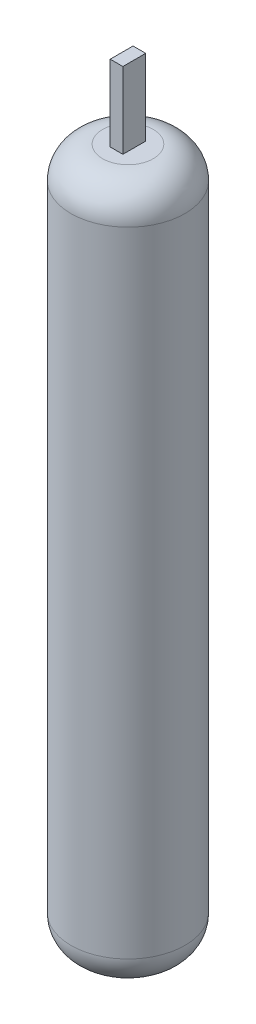
ISO-10303-21;
HEADER;
FILE_DESCRIPTION(('STEP AP214'),'2;1');
FILE_NAME('part.step','',(''),(''),'','','');
FILE_SCHEMA(('AUTOMOTIVE_DESIGN { 1 0 10303 214 1 1 1 1 }'));
ENDSEC;
DATA;
#1=APPLICATION_CONTEXT('core data for automotive mechanical design processes');
#2=APPLICATION_PROTOCOL_DEFINITION('international standard','automotive_design',2000,#1);
#3=PRODUCT_CONTEXT('',#1,'mechanical');
#4=PRODUCT('Part','Part','',(#3));
#5=PRODUCT_RELATED_PRODUCT_CATEGORY('part','',(#4));
#6=PRODUCT_DEFINITION_FORMATION('','',#4);
#7=PRODUCT_DEFINITION_CONTEXT('part definition',#1,'design');
#8=PRODUCT_DEFINITION('design','',#6,#7);
#9=PRODUCT_DEFINITION_SHAPE('','',#8);
#10=(LENGTH_UNIT() NAMED_UNIT(*) SI_UNIT(.MILLI.,.METRE.));
#11=(NAMED_UNIT(*) PLANE_ANGLE_UNIT() SI_UNIT($,.RADIAN.));
#12=(NAMED_UNIT(*) SI_UNIT($,.STERADIAN.) SOLID_ANGLE_UNIT());
#13=UNCERTAINTY_MEASURE_WITH_UNIT(LENGTH_MEASURE(1.E-05),#10,'distance_accuracy_value','');
#14=(GEOMETRIC_REPRESENTATION_CONTEXT(3) GLOBAL_UNCERTAINTY_ASSIGNED_CONTEXT((#13)) GLOBAL_UNIT_ASSIGNED_CONTEXT((#10,
#11,#12)) REPRESENTATION_CONTEXT('',''));
#15=CARTESIAN_POINT('',(0.,0.,0.));
#16=DIRECTION('',(0.,0.,1.));
#17=DIRECTION('',(1.,0.,0.));
#18=AXIS2_PLACEMENT_3D('',#15,#16,#17);
#19=CARTESIAN_POINT('',(0.,55.,0.));
#20=DIRECTION('',(0.,-1.,0.));
#21=DIRECTION('',(0.,0.,-1.));
#22=AXIS2_PLACEMENT_3D('',#19,#20,#21);
#23=CYLINDRICAL_SURFACE('',#22,4.5);
#24=CARTESIAN_POINT('',(0.,52.5,0.));
#25=DIRECTION('',(0.,1.,0.));
#26=DIRECTION('',(0.,0.,1.));
#27=AXIS2_PLACEMENT_3D('',#24,#25,#26);
#28=CIRCLE('',#27,4.5);
#29=CARTESIAN_POINT('',(0.,52.5,4.5));
#30=VERTEX_POINT('',#29);
#31=EDGE_CURVE('E48',#30,#30,#28,.F.);
#32=ORIENTED_EDGE('',*,*,#31,.T.);
#33=EDGE_LOOP('',(#32));
#34=FACE_BOUND('',#33,.T.);
#35=CARTESIAN_POINT('',(0.,2.5,0.));
#36=DIRECTION('',(0.,1.,0.));
#37=DIRECTION('',(0.,0.,1.));
#38=AXIS2_PLACEMENT_3D('',#35,#36,#37);
#39=CIRCLE('',#38,4.5);
#40=CARTESIAN_POINT('',(0.,2.5,4.5));
#41=VERTEX_POINT('',#40);
#42=EDGE_CURVE('E201',#41,#41,#39,.T.);
#43=ORIENTED_EDGE('',*,*,#42,.T.);
#44=EDGE_LOOP('',(#43));
#45=FACE_BOUND('',#44,.T.);
#46=ADVANCED_FACE('F39',(#34,#45),#23,.T.);
#47=CARTESIAN_POINT('',(0.,55.,0.));
#48=DIRECTION('',(0.,1.,0.));
#49=DIRECTION('',(0.,0.,1.));
#50=AXIS2_PLACEMENT_3D('',#47,#48,#49);
#51=PLANE('',#50);
#52=CARTESIAN_POINT('',(0.,55.,0.));
#53=DIRECTION('',(0.,1.,0.));
#54=DIRECTION('',(0.,0.,1.));
#55=AXIS2_PLACEMENT_3D('',#52,#53,#54);
#56=CIRCLE('',#55,2.);
#57=CARTESIAN_POINT('',(0.,55.,2.));
#58=VERTEX_POINT('',#57);
#59=EDGE_CURVE('E197',#58,#58,#56,.T.);
#60=ORIENTED_EDGE('',*,*,#59,.T.);
#61=EDGE_LOOP('',(#60));
#62=FACE_BOUND('',#61,.T.);
#63=DIRECTION('',(0.,0.,1.));
#64=VECTOR('',#63,1.);
#65=CARTESIAN_POINT('',(-0.5,55.,-0.9));
#66=LINE('',#65,#64);
#67=CARTESIAN_POINT('',(-0.5,55.,-0.9));
#68=VERTEX_POINT('',#67);
#69=CARTESIAN_POINT('',(-0.5,55.,0.9));
#70=VERTEX_POINT('',#69);
#71=EDGE_CURVE('E63',#68,#70,#66,.T.);
#72=ORIENTED_EDGE('',*,*,#71,.F.);
#73=DIRECTION('',(-1.,0.,0.));
#74=VECTOR('',#73,1.);
#75=CARTESIAN_POINT('',(-0.5,55.,-0.9));
#76=LINE('',#75,#74);
#77=CARTESIAN_POINT('',(0.5,55.,-0.9));
#78=VERTEX_POINT('',#77);
#79=EDGE_CURVE('E160',#78,#68,#76,.T.);
#80=ORIENTED_EDGE('',*,*,#79,.F.);
#81=DIRECTION('',(0.,0.,-1.));
#82=VECTOR('',#81,1.);
#83=CARTESIAN_POINT('',(0.5,55.,-0.9));
#84=LINE('',#83,#82);
#85=CARTESIAN_POINT('',(0.5,55.,0.9));
#86=VERTEX_POINT('',#85);
#87=EDGE_CURVE('E176',#86,#78,#84,.T.);
#88=ORIENTED_EDGE('',*,*,#87,.F.);
#89=DIRECTION('',(1.,0.,0.));
#90=VECTOR('',#89,1.);
#91=CARTESIAN_POINT('',(-0.5,55.,0.9));
#92=LINE('',#91,#90);
#93=EDGE_CURVE('E172',#70,#86,#92,.T.);
#94=ORIENTED_EDGE('',*,*,#93,.F.);
#95=EDGE_LOOP('',(#72,#80,#88,#94));
#96=FACE_BOUND('',#95,.T.);
#97=ADVANCED_FACE('F215',(#62,#96),#51,.T.);
#98=CARTESIAN_POINT('',(0.,0.,0.));
#99=DIRECTION('',(0.,1.,0.));
#100=DIRECTION('',(0.,0.,1.));
#101=AXIS2_PLACEMENT_3D('',#98,#99,#100);
#102=PLANE('',#101);
#103=CARTESIAN_POINT('',(0.,0.,0.));
#104=DIRECTION('',(0.,1.,0.));
#105=DIRECTION('',(0.,0.,1.));
#106=AXIS2_PLACEMENT_3D('',#103,#104,#105);
#107=CIRCLE('',#106,2.);
#108=CARTESIAN_POINT('',(0.,0.,2.));
#109=VERTEX_POINT('',#108);
#110=EDGE_CURVE('E11',#109,#109,#107,.F.);
#111=ORIENTED_EDGE('',*,*,#110,.T.);
#112=EDGE_LOOP('',(#111));
#113=FACE_BOUND('',#112,.T.);
#114=DIRECTION('',(1.,0.,0.));
#115=VECTOR('',#114,1.);
#116=CARTESIAN_POINT('',(-0.6,0.,-1.));
#117=LINE('',#116,#115);
#118=CARTESIAN_POINT('',(-0.6,0.,-1.));
#119=VERTEX_POINT('',#118);
#120=CARTESIAN_POINT('',(0.6,0.,-1.));
#121=VERTEX_POINT('',#120);
#122=EDGE_CURVE('E141',#119,#121,#117,.T.);
#123=ORIENTED_EDGE('',*,*,#122,.F.);
#124=DIRECTION('',(0.,0.,-1.));
#125=VECTOR('',#124,1.);
#126=CARTESIAN_POINT('',(-0.600000000000001,0.,1.));
#127=LINE('',#126,#125);
#128=CARTESIAN_POINT('',(-0.600000000000001,0.,1.));
#129=VERTEX_POINT('',#128);
#130=EDGE_CURVE('E55',#129,#119,#127,.T.);
#131=ORIENTED_EDGE('',*,*,#130,.F.);
#132=DIRECTION('',(-1.,0.,0.));
#133=VECTOR('',#132,1.);
#134=CARTESIAN_POINT('',(0.6,0.,1.));
#135=LINE('',#134,#133);
#136=CARTESIAN_POINT('',(0.6,0.,1.));
#137=VERTEX_POINT('',#136);
#138=EDGE_CURVE('E128',#137,#129,#135,.T.);
#139=ORIENTED_EDGE('',*,*,#138,.F.);
#140=DIRECTION('',(0.,0.,1.));
#141=VECTOR('',#140,1.);
#142=CARTESIAN_POINT('',(0.6,0.,-1.));
#143=LINE('',#142,#141);
#144=EDGE_CURVE('E132',#121,#137,#143,.T.);
#145=ORIENTED_EDGE('',*,*,#144,.F.);
#146=EDGE_LOOP('',(#123,#131,#139,#145));
#147=FACE_BOUND('',#146,.T.);
#148=ADVANCED_FACE('F217',(#113,#147),#102,.F.);
#149=CARTESIAN_POINT('',(-0.5,61.,-0.9));
#150=DIRECTION('',(1.,0.,0.));
#151=DIRECTION('',(0.,0.,-1.));
#152=AXIS2_PLACEMENT_3D('',#149,#150,#151);
#153=PLANE('',#152);
#154=ORIENTED_EDGE('',*,*,#71,.T.);
#155=DIRECTION('',(0.,-1.,0.));
#156=VECTOR('',#155,1.);
#157=CARTESIAN_POINT('',(-0.5,61.,0.9));
#158=LINE('',#157,#156);
#159=CARTESIAN_POINT('',(-0.5,61.,0.9));
#160=VERTEX_POINT('',#159);
#161=EDGE_CURVE('E193',#160,#70,#158,.T.);
#162=ORIENTED_EDGE('',*,*,#161,.F.);
#163=DIRECTION('',(0.,0.,1.));
#164=VECTOR('',#163,1.);
#165=CARTESIAN_POINT('',(-0.5,61.,-0.9));
#166=LINE('',#165,#164);
#167=CARTESIAN_POINT('',(-0.5,61.,-0.9));
#168=VERTEX_POINT('',#167);
#169=EDGE_CURVE('E155',#168,#160,#166,.T.);
#170=ORIENTED_EDGE('',*,*,#169,.F.);
#171=DIRECTION('',(0.,-1.,0.));
#172=VECTOR('',#171,1.);
#173=CARTESIAN_POINT('',(-0.5,61.,-0.9));
#174=LINE('',#173,#172);
#175=EDGE_CURVE('E169',#168,#68,#174,.T.);
#176=ORIENTED_EDGE('',*,*,#175,.T.);
#177=EDGE_LOOP('',(#154,#162,#170,#176));
#178=FACE_BOUND('',#177,.T.);
#179=ADVANCED_FACE('F223',(#178),#153,.F.);
#180=CARTESIAN_POINT('',(-0.5,61.,0.9));
#181=DIRECTION('',(0.,0.,-1.));
#182=DIRECTION('',(-1.,0.,0.));
#183=AXIS2_PLACEMENT_3D('',#180,#181,#182);
#184=PLANE('',#183);
#185=ORIENTED_EDGE('',*,*,#93,.T.);
#186=DIRECTION('',(0.,-1.,0.));
#187=VECTOR('',#186,1.);
#188=CARTESIAN_POINT('',(0.5,61.,0.9));
#189=LINE('',#188,#187);
#190=CARTESIAN_POINT('',(0.5,61.,0.9));
#191=VERTEX_POINT('',#190);
#192=EDGE_CURVE('E189',#191,#86,#189,.T.);
#193=ORIENTED_EDGE('',*,*,#192,.F.);
#194=DIRECTION('',(1.,0.,0.));
#195=VECTOR('',#194,1.);
#196=CARTESIAN_POINT('',(-0.5,61.,0.9));
#197=LINE('',#196,#195);
#198=EDGE_CURVE('E159',#160,#191,#197,.T.);
#199=ORIENTED_EDGE('',*,*,#198,.F.);
#200=ORIENTED_EDGE('',*,*,#161,.T.);
#201=EDGE_LOOP('',(#185,#193,#199,#200));
#202=FACE_BOUND('',#201,.T.);
#203=ADVANCED_FACE('F230',(#202),#184,.F.);
#204=CARTESIAN_POINT('',(0.5,61.,-0.9));
#205=DIRECTION('',(-1.,0.,0.));
#206=DIRECTION('',(0.,0.,1.));
#207=AXIS2_PLACEMENT_3D('',#204,#205,#206);
#208=PLANE('',#207);
#209=ORIENTED_EDGE('',*,*,#87,.T.);
#210=DIRECTION('',(0.,-1.,0.));
#211=VECTOR('',#210,1.);
#212=CARTESIAN_POINT('',(0.5,61.,-0.9));
#213=LINE('',#212,#211);
#214=CARTESIAN_POINT('',(0.5,61.,-0.9));
#215=VERTEX_POINT('',#214);
#216=EDGE_CURVE('E185',#215,#78,#213,.T.);
#217=ORIENTED_EDGE('',*,*,#216,.F.);
#218=DIRECTION('',(0.,0.,-1.));
#219=VECTOR('',#218,1.);
#220=CARTESIAN_POINT('',(0.5,61.,-0.9));
#221=LINE('',#220,#219);
#222=EDGE_CURVE('E163',#191,#215,#221,.T.);
#223=ORIENTED_EDGE('',*,*,#222,.F.);
#224=ORIENTED_EDGE('',*,*,#192,.T.);
#225=EDGE_LOOP('',(#209,#217,#223,#224));
#226=FACE_BOUND('',#225,.T.);
#227=ADVANCED_FACE('F234',(#226),#208,.F.);
#228=CARTESIAN_POINT('',(-0.5,61.,-0.9));
#229=DIRECTION('',(0.,0.,1.));
#230=DIRECTION('',(1.,0.,0.));
#231=AXIS2_PLACEMENT_3D('',#228,#229,#230);
#232=PLANE('',#231);
#233=ORIENTED_EDGE('',*,*,#79,.T.);
#234=ORIENTED_EDGE('',*,*,#175,.F.);
#235=DIRECTION('',(-1.,0.,0.));
#236=VECTOR('',#235,1.);
#237=CARTESIAN_POINT('',(-0.5,61.,-0.9));
#238=LINE('',#237,#236);
#239=EDGE_CURVE('E166',#215,#168,#238,.T.);
#240=ORIENTED_EDGE('',*,*,#239,.F.);
#241=ORIENTED_EDGE('',*,*,#216,.T.);
#242=EDGE_LOOP('',(#233,#234,#240,#241));
#243=FACE_BOUND('',#242,.T.);
#244=ADVANCED_FACE('F238',(#243),#232,.F.);
#245=CARTESIAN_POINT('',(0.,61.,0.));
#246=DIRECTION('',(0.,1.,0.));
#247=DIRECTION('',(0.,0.,1.));
#248=AXIS2_PLACEMENT_3D('',#245,#246,#247);
#249=PLANE('',#248);
#250=ORIENTED_EDGE('',*,*,#169,.T.);
#251=ORIENTED_EDGE('',*,*,#198,.T.);
#252=ORIENTED_EDGE('',*,*,#222,.T.);
#253=ORIENTED_EDGE('',*,*,#239,.T.);
#254=EDGE_LOOP('',(#250,#251,#252,#253));
#255=FACE_BOUND('',#254,.T.);
#256=ADVANCED_FACE('F242',(#255),#249,.T.);
#257=CARTESIAN_POINT('',(-0.600000000000001,6.,1.));
#258=DIRECTION('',(-1.,0.,0.));
#259=DIRECTION('',(0.,0.,1.));
#260=AXIS2_PLACEMENT_3D('',#257,#258,#259);
#261=PLANE('',#260);
#262=ORIENTED_EDGE('',*,*,#130,.T.);
#263=DIRECTION('',(0.,-1.,0.));
#264=VECTOR('',#263,1.);
#265=CARTESIAN_POINT('',(-0.6,6.,-1.));
#266=LINE('',#265,#264);
#267=CARTESIAN_POINT('',(-0.6,6.,-1.));
#268=VERTEX_POINT('',#267);
#269=EDGE_CURVE('E103',#268,#119,#266,.T.);
#270=ORIENTED_EDGE('',*,*,#269,.F.);
#271=DIRECTION('',(0.,0.,-1.));
#272=VECTOR('',#271,1.);
#273=CARTESIAN_POINT('',(-0.600000000000001,6.,1.));
#274=LINE('',#273,#272);
#275=CARTESIAN_POINT('',(-0.600000000000001,6.,1.));
#276=VERTEX_POINT('',#275);
#277=EDGE_CURVE('E107',#276,#268,#274,.T.);
#278=ORIENTED_EDGE('',*,*,#277,.F.);
#279=DIRECTION('',(0.,-1.,0.));
#280=VECTOR('',#279,1.);
#281=CARTESIAN_POINT('',(-0.600000000000001,6.,1.));
#282=LINE('',#281,#280);
#283=EDGE_CURVE('E147',#276,#129,#282,.T.);
#284=ORIENTED_EDGE('',*,*,#283,.T.);
#285=EDGE_LOOP('',(#262,#270,#278,#284));
#286=FACE_BOUND('',#285,.T.);
#287=ADVANCED_FACE('F105',(#286),#261,.F.);
#288=CARTESIAN_POINT('',(0.6,6.,1.));
#289=DIRECTION('',(0.,0.,1.));
#290=DIRECTION('',(1.,0.,0.));
#291=AXIS2_PLACEMENT_3D('',#288,#289,#290);
#292=PLANE('',#291);
#293=ORIENTED_EDGE('',*,*,#138,.T.);
#294=ORIENTED_EDGE('',*,*,#283,.F.);
#295=DIRECTION('',(-1.,0.,0.));
#296=VECTOR('',#295,1.);
#297=CARTESIAN_POINT('',(0.6,6.,1.));
#298=LINE('',#297,#296);
#299=CARTESIAN_POINT('',(0.6,6.,1.));
#300=VERTEX_POINT('',#299);
#301=EDGE_CURVE('E114',#300,#276,#298,.T.);
#302=ORIENTED_EDGE('',*,*,#301,.F.);
#303=DIRECTION('',(0.,-1.,0.));
#304=VECTOR('',#303,1.);
#305=CARTESIAN_POINT('',(0.6,6.,1.));
#306=LINE('',#305,#304);
#307=EDGE_CURVE('E150',#300,#137,#306,.T.);
#308=ORIENTED_EDGE('',*,*,#307,.T.);
#309=EDGE_LOOP('',(#293,#294,#302,#308));
#310=FACE_BOUND('',#309,.T.);
#311=ADVANCED_FACE('F249',(#310),#292,.F.);
#312=CARTESIAN_POINT('',(0.6,6.,-1.));
#313=DIRECTION('',(1.,0.,0.));
#314=DIRECTION('',(0.,0.,-1.));
#315=AXIS2_PLACEMENT_3D('',#312,#313,#314);
#316=PLANE('',#315);
#317=ORIENTED_EDGE('',*,*,#144,.T.);
#318=ORIENTED_EDGE('',*,*,#307,.F.);
#319=DIRECTION('',(0.,0.,1.));
#320=VECTOR('',#319,1.);
#321=CARTESIAN_POINT('',(0.6,6.,-1.));
#322=LINE('',#321,#320);
#323=CARTESIAN_POINT('',(0.6,6.,-1.));
#324=VERTEX_POINT('',#323);
#325=EDGE_CURVE('E123',#324,#300,#322,.T.);
#326=ORIENTED_EDGE('',*,*,#325,.F.);
#327=DIRECTION('',(0.,-1.,0.));
#328=VECTOR('',#327,1.);
#329=CARTESIAN_POINT('',(0.6,6.,-1.));
#330=LINE('',#329,#328);
#331=EDGE_CURVE('E113',#324,#121,#330,.T.);
#332=ORIENTED_EDGE('',*,*,#331,.T.);
#333=EDGE_LOOP('',(#317,#318,#326,#332));
#334=FACE_BOUND('',#333,.T.);
#335=ADVANCED_FACE('F252',(#334),#316,.F.);
#336=CARTESIAN_POINT('',(-0.6,6.,-1.));
#337=DIRECTION('',(0.,0.,-1.));
#338=DIRECTION('',(-1.,0.,0.));
#339=AXIS2_PLACEMENT_3D('',#336,#337,#338);
#340=PLANE('',#339);
#341=ORIENTED_EDGE('',*,*,#122,.T.);
#342=ORIENTED_EDGE('',*,*,#331,.F.);
#343=DIRECTION('',(1.,0.,0.));
#344=VECTOR('',#343,1.);
#345=CARTESIAN_POINT('',(-0.6,6.,-1.));
#346=LINE('',#345,#344);
#347=EDGE_CURVE('E117',#268,#324,#346,.T.);
#348=ORIENTED_EDGE('',*,*,#347,.F.);
#349=ORIENTED_EDGE('',*,*,#269,.T.);
#350=EDGE_LOOP('',(#341,#342,#348,#349));
#351=FACE_BOUND('',#350,.T.);
#352=ADVANCED_FACE('F118',(#351),#340,.F.);
#353=CARTESIAN_POINT('',(0.,6.,0.));
#354=DIRECTION('',(0.,-1.,0.));
#355=DIRECTION('',(0.,0.,-1.));
#356=AXIS2_PLACEMENT_3D('',#353,#354,#355);
#357=PLANE('',#356);
#358=ORIENTED_EDGE('',*,*,#277,.T.);
#359=ORIENTED_EDGE('',*,*,#347,.T.);
#360=ORIENTED_EDGE('',*,*,#325,.T.);
#361=ORIENTED_EDGE('',*,*,#301,.T.);
#362=EDGE_LOOP('',(#358,#359,#360,#361));
#363=FACE_BOUND('',#362,.T.);
#364=ADVANCED_FACE('F125',(#363),#357,.T.);
#365=CARTESIAN_POINT('',(0.,52.5,0.));
#366=DIRECTION('',(0.,1.,0.));
#367=DIRECTION('',(0.,0.,1.));
#368=AXIS2_PLACEMENT_3D('',#365,#366,#367);
#369=DEGENERATE_TOROIDAL_SURFACE('',#368,2.,2.5,.T.);
#370=ORIENTED_EDGE('',*,*,#31,.F.);
#371=EDGE_LOOP('',(#370));
#372=FACE_BOUND('',#371,.T.);
#373=ORIENTED_EDGE('',*,*,#59,.F.);
#374=EDGE_LOOP('',(#373));
#375=FACE_BOUND('',#374,.T.);
#376=ADVANCED_FACE('F210',(#372,#375),#369,.T.);
#377=CARTESIAN_POINT('',(0.,2.5,0.));
#378=DIRECTION('',(0.,1.,0.));
#379=DIRECTION('',(0.,0.,1.));
#380=AXIS2_PLACEMENT_3D('',#377,#378,#379);
#381=DEGENERATE_TOROIDAL_SURFACE('',#380,2.,2.5,.T.);
#382=ORIENTED_EDGE('',*,*,#110,.F.);
#383=EDGE_LOOP('',(#382));
#384=FACE_BOUND('',#383,.T.);
#385=ORIENTED_EDGE('',*,*,#42,.F.);
#386=EDGE_LOOP('',(#385));
#387=FACE_BOUND('',#386,.T.);
#388=ADVANCED_FACE('F41',(#384,#387),#381,.T.);
#389=CLOSED_SHELL('',(#46,#97,#148,#179,#203,#227,#244,#256,#287,#311,#335,#352,#364,#376,#388));
#390=MANIFOLD_SOLID_BREP('B2',#389);
#391=ADVANCED_BREP_SHAPE_REPRESENTATION('',(#18,#390),#14);
#392=SHAPE_DEFINITION_REPRESENTATION(#9,#391);
ENDSEC;
END-ISO-10303-21;
